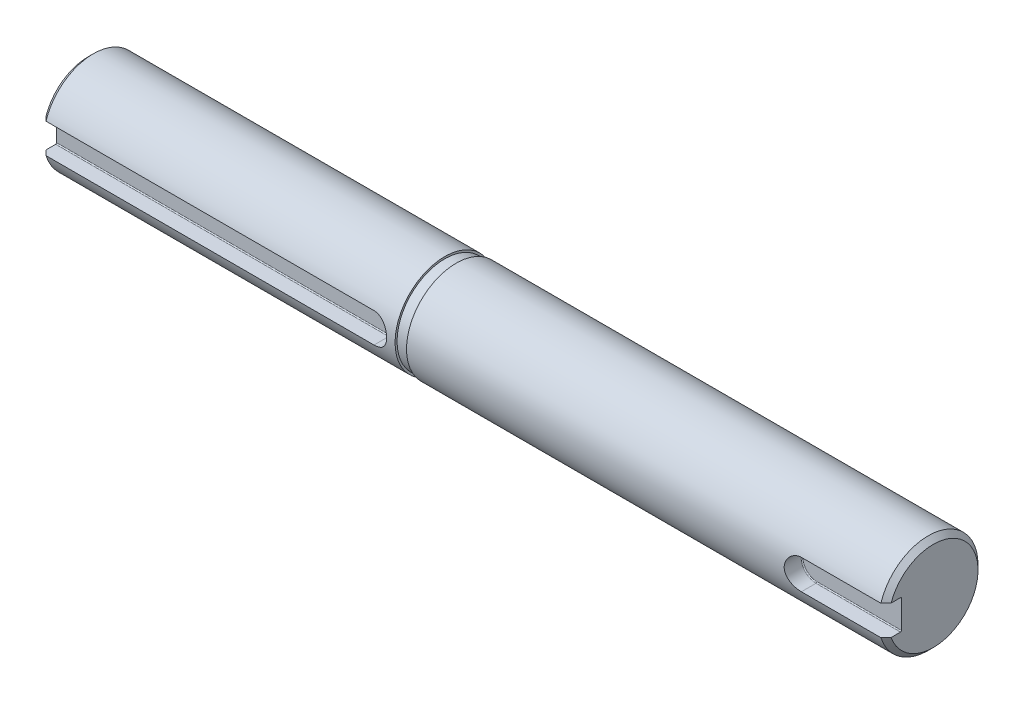
ISO-10303-21;
HEADER;
FILE_DESCRIPTION(('STEP AP214'),'2;1');
FILE_NAME('part.step','',(''),(''),'','','');
FILE_SCHEMA(('AUTOMOTIVE_DESIGN { 1 0 10303 214 1 1 1 1 }'));
ENDSEC;
DATA;
#1=APPLICATION_CONTEXT('core data for automotive mechanical design processes');
#2=APPLICATION_PROTOCOL_DEFINITION('international standard','automotive_design',2000,#1);
#3=PRODUCT_CONTEXT('',#1,'mechanical');
#4=PRODUCT('Part','Part','',(#3));
#5=PRODUCT_RELATED_PRODUCT_CATEGORY('part','',(#4));
#6=PRODUCT_DEFINITION_FORMATION('','',#4);
#7=PRODUCT_DEFINITION_CONTEXT('part definition',#1,'design');
#8=PRODUCT_DEFINITION('design','',#6,#7);
#9=PRODUCT_DEFINITION_SHAPE('','',#8);
#10=(LENGTH_UNIT() NAMED_UNIT(*) SI_UNIT(.MILLI.,.METRE.));
#11=(NAMED_UNIT(*) PLANE_ANGLE_UNIT() SI_UNIT($,.RADIAN.));
#12=(NAMED_UNIT(*) SI_UNIT($,.STERADIAN.) SOLID_ANGLE_UNIT());
#13=UNCERTAINTY_MEASURE_WITH_UNIT(LENGTH_MEASURE(1.E-05),#10,'distance_accuracy_value','');
#14=(GEOMETRIC_REPRESENTATION_CONTEXT(3) GLOBAL_UNCERTAINTY_ASSIGNED_CONTEXT((#13)) GLOBAL_UNIT_ASSIGNED_CONTEXT((#10,
#11,#12)) REPRESENTATION_CONTEXT('',''));
#15=CARTESIAN_POINT('',(0.,0.,0.));
#16=DIRECTION('',(0.,0.,1.));
#17=DIRECTION('',(1.,0.,0.));
#18=AXIS2_PLACEMENT_3D('',#15,#16,#17);
#19=CARTESIAN_POINT('',(0.,0.,0.));
#20=DIRECTION('',(-1.,0.,0.));
#21=DIRECTION('',(0.,0.,1.));
#22=AXIS2_PLACEMENT_3D('',#19,#20,#21);
#23=CYLINDRICAL_SURFACE('',#22,5.);
#24=CARTESIAN_POINT('',(35.,0.,5.));
#25=CARTESIAN_POINT('',(34.9999990025151,-0.0822886127533,4.9999992925055));
#26=CARTESIAN_POINT('',(34.993206136376,-0.16458731835153,4.99794915693954));
#27=CARTESIAN_POINT('',(34.9662786457779,-0.32678812530488,4.98997105593691));
#28=CARTESIAN_POINT('',(34.9461400419767,-0.406689504411418,4.98404193389692));
#29=CARTESIAN_POINT('',(34.8932539830897,-0.561732707754526,4.96895552501836));
#30=CARTESIAN_POINT('',(34.8605251303811,-0.636881364395373,4.95980300250425));
#31=CARTESIAN_POINT('',(34.7834639069442,-0.780624181053131,4.93922109237645));
#32=CARTESIAN_POINT('',(34.7391299926046,-0.849217467469667,4.92779140192067));
#33=CARTESIAN_POINT('',(34.6387759925273,-0.979871797183742,4.90350737192774));
#34=CARTESIAN_POINT('',(34.5824833741141,-1.04171807124434,4.89062383657036));
#35=CARTESIAN_POINT('',(34.4603907700898,-1.15524920923324,4.86505834210442));
#36=CARTESIAN_POINT('',(34.394589187875,-1.20693236327441,4.85237641724501));
#37=CARTESIAN_POINT('',(34.2535292469624,-1.29980037723707,4.82834113993772));
#38=CARTESIAN_POINT('',(34.1780915390093,-1.34072309022213,4.81702406663875));
#39=CARTESIAN_POINT('',(34.0210107457697,-1.4092139477476,4.79743620394031));
#40=CARTESIAN_POINT('',(33.939369156072,-1.43678529919973,4.78916468313311));
#41=CARTESIAN_POINT('',(33.7746097338695,-1.47701633682651,4.77690870838435));
#42=CARTESIAN_POINT('',(33.6915972561361,-1.49007196234677,4.77281069324534));
#43=CARTESIAN_POINT('',(33.5244668437832,-1.50213730614671,4.76902789749767));
#44=CARTESIAN_POINT('',(33.4403491819409,-1.50115042761078,4.76934204760571));
#45=CARTESIAN_POINT('',(33.2766160913915,-1.48546977199811,4.77424744067778));
#46=CARTESIAN_POINT('',(33.1969477496378,-1.47127205262685,4.77868388599141));
#47=CARTESIAN_POINT('',(33.0411802137265,-1.43037420427055,4.79108356228624));
#48=CARTESIAN_POINT('',(32.9650813726257,-1.4036728414164,4.79904714132351));
#49=CARTESIAN_POINT('',(32.8173996503393,-1.33816026653681,4.81772733074973));
#50=CARTESIAN_POINT('',(32.7458929160447,-1.29918816934642,4.82848016115952));
#51=CARTESIAN_POINT('',(32.6102679779898,-1.21035222588682,4.85150987000065));
#52=CARTESIAN_POINT('',(32.5461515705862,-1.16048574002588,4.86378711746991));
#53=CARTESIAN_POINT('',(32.424313809238,-1.04881290765546,4.88911011297937));
#54=CARTESIAN_POINT('',(32.3669713359703,-0.986594907466966,4.90216654310498));
#55=CARTESIAN_POINT('',(32.2634460159358,-0.85326325931396,4.92712244063259));
#56=CARTESIAN_POINT('',(32.2172638715856,-0.782149051860881,4.9390218351841));
#57=CARTESIAN_POINT('',(32.1371400775353,-0.632355038342795,4.9604316006947));
#58=CARTESIAN_POINT('',(32.1032824837501,-0.553627749747942,4.96992543668314));
#59=CARTESIAN_POINT('',(32.0494004099004,-0.391245415603511,4.98533521832222));
#60=CARTESIAN_POINT('',(32.0293720714675,-0.307591751589574,4.99125216186999));
#61=CARTESIAN_POINT('',(32.0043478221006,-0.140952242668326,4.99868364643538));
#62=CARTESIAN_POINT('',(31.9988384141984,-0.0580500976011819,5.0003485041779));
#63=CARTESIAN_POINT('',(32.0015691557121,0.107499605823387,4.9995292324176));
#64=CARTESIAN_POINT('',(32.0098074696515,0.190147196690784,4.99704565677756));
#65=CARTESIAN_POINT('',(32.0393846111115,0.350903605309698,4.98830696987163));
#66=CARTESIAN_POINT('',(32.0604233875809,0.42907277261417,4.98213829799417));
#67=CARTESIAN_POINT('',(32.1146432327782,0.580754638954522,4.96674347841533));
#68=CARTESIAN_POINT('',(32.1478257610379,0.654266777025584,4.95751696321085));
#69=CARTESIAN_POINT('',(32.2262531654811,0.796437189461054,4.93669654351325));
#70=CARTESIAN_POINT('',(32.271759340948,0.864943826199672,4.92505280829675));
#71=CARTESIAN_POINT('',(32.3732247540528,0.993523307980149,4.90073468764317));
#72=CARTESIAN_POINT('',(32.4291866118877,1.05359403235594,4.8880600443108));
#73=CARTESIAN_POINT('',(32.5523873083694,1.16585744551027,4.86253171869138));
#74=CARTESIAN_POINT('',(32.6199618757718,1.21768481231504,4.84968825033268));
#75=CARTESIAN_POINT('',(32.7631279390136,1.30928995072153,4.82576515238464));
#76=CARTESIAN_POINT('',(32.8387192245582,1.34906803829472,4.81468547654651));
#77=CARTESIAN_POINT('',(32.9955324912547,1.41517347127168,4.79567189615055));
#78=CARTESIAN_POINT('',(33.0767261865366,1.44156346937049,4.78772337843827));
#79=CARTESIAN_POINT('',(33.2426879689315,1.48021730815114,4.77591594362794));
#80=CARTESIAN_POINT('',(33.3274548207877,1.49248598978779,4.772055625083));
#81=CARTESIAN_POINT('',(33.4943615183762,1.50221984485059,4.76899972496087));
#82=CARTESIAN_POINT('',(33.5764636510176,1.5002805530849,4.76961647442755));
#83=CARTESIAN_POINT('',(33.7391141033728,1.48307505444813,4.77499401288294));
#84=CARTESIAN_POINT('',(33.8196624851764,1.46780938124716,4.77975463592551));
#85=CARTESIAN_POINT('',(33.9759453991429,1.42476888804136,4.79275763670386));
#86=CARTESIAN_POINT('',(34.0517272873617,1.39715175507068,4.80095604545965));
#87=CARTESIAN_POINT('',(34.1976424388177,1.33031507121129,4.81990278909136));
#88=CARTESIAN_POINT('',(34.2677746176408,1.29109329962876,4.83065161194312));
#89=CARTESIAN_POINT('',(34.4031631165271,1.20048763805072,4.85397676425833));
#90=CARTESIAN_POINT('',(34.4681487612604,1.14871276092994,4.86660540163798));
#91=CARTESIAN_POINT('',(34.5887024983079,1.03517434629782,4.89201320450026));
#92=CARTESIAN_POINT('',(34.6442681394678,0.973408217134498,4.90479240823905));
#93=CARTESIAN_POINT('',(34.746023412295,0.839465762183244,4.92950936570649));
#94=CARTESIAN_POINT('',(34.7918914468555,0.767037885790604,4.94141159765674));
#95=CARTESIAN_POINT('',(34.870735169904,0.615141373983525,4.96260680455813));
#96=CARTESIAN_POINT('',(34.9037168882745,0.535676052998949,4.97190099931067));
#97=CARTESIAN_POINT('',(34.9528952756528,0.380757712655275,4.98602174969301));
#98=CARTESIAN_POINT('',(34.9705116728833,0.305786961954229,4.99122027381068));
#99=CARTESIAN_POINT('',(34.9940635252416,0.153880195230777,4.99820944494492));
#100=CARTESIAN_POINT('',(35.0000009327048,0.0769445098581386,5.0000006615474));
#101=CARTESIAN_POINT('',(35.,0.,5.));
#102=B_SPLINE_CURVE_WITH_KNOTS('',3,(#24,#25,#26,#27,#28,#29,#30,#31,#32,#33,#34,#35,#36,#37,
#38,#39,#40,#41,#42,#43,#44,#45,#46,#47,#48,#49,#50,#51,#52,#53,#54,#55,#56,#57,#58,#59,#60,#61,
#62,#63,#64,#65,#66,#67,#68,#69,#70,#71,#72,#73,#74,#75,#76,#77,#78,#79,#80,#81,#82,#83,#84,#85,
#86,#87,#88,#89,#90,#91,#92,#93,#94,#95,#96,#97,#98,#99,#100,#101),.UNSPECIFIED.,.T.,.F.,(4,2,2,
2,2,2,2,2,2,2,2,2,2,2,2,2,2,2,2,2,2,2,2,2,2,2,2,2,2,2,2,2,2,2,2,2,2,2,4),(0.,0.24658320361261,
0.493239964845999,0.739533676300875,0.985860164412699,1.23855602948191,1.49129437288633,
1.74971481004109,2.00807314543224,2.25919689356598,2.51025978319088,2.75226016697675,
2.99428443658001,3.23962426447119,3.48502360158554,3.74067104048166,3.99633456531071,
4.25371046881688,4.51101453528807,4.75908809438544,5.00712853550325,5.24956746682325,
5.49203554593727,5.74011305702907,5.98825282000189,6.24540400322817,6.50254844252679,
6.7584781495125,7.01432009460281,7.2595015546694,7.50467319661598,7.74680040402719,
7.98897397553105,8.23996925679928,8.491029748975,8.74942996156668,9.00770911595233,
9.23831691930457,9.46888616948871),.UNSPECIFIED.);
#103=CARTESIAN_POINT('',(33.5,1.5,4.76969600708473));
#104=VERTEX_POINT('',#103);
#105=CARTESIAN_POINT('',(33.5,-1.49999999999999,4.76969600708473));
#106=VERTEX_POINT('',#105);
#107=EDGE_CURVE('E276',#104,#106,#102,.T.);
#108=ORIENTED_EDGE('',*,*,#107,.T.);
#109=DIRECTION('',(-1.,0.,0.));
#110=VECTOR('',#109,1.);
#111=CARTESIAN_POINT('',(0.,-1.5,4.76969600708473));
#112=LINE('',#111,#110);
#113=CARTESIAN_POINT('',(0.500000000000014,-1.5,4.76969600708473));
#114=VERTEX_POINT('',#113);
#115=EDGE_CURVE('E231',#106,#114,#112,.T.);
#116=ORIENTED_EDGE('',*,*,#115,.T.);
#117=CARTESIAN_POINT('',(0.500000000000014,0.,0.));
#118=DIRECTION('',(1.,0.,0.));
#119=DIRECTION('',(0.,0.,-1.));
#120=AXIS2_PLACEMENT_3D('',#117,#118,#119);
#121=CIRCLE('',#120,5.);
#122=CARTESIAN_POINT('',(0.500000000000014,1.5,4.76969600708473));
#123=VERTEX_POINT('',#122);
#124=EDGE_CURVE('E240',#114,#123,#121,.T.);
#125=ORIENTED_EDGE('',*,*,#124,.T.);
#126=DIRECTION('',(-1.,0.,0.));
#127=VECTOR('',#126,1.);
#128=CARTESIAN_POINT('',(0.,1.5,4.76969600708473));
#129=LINE('',#128,#127);
#130=EDGE_CURVE('E66',#123,#104,#129,.F.);
#131=ORIENTED_EDGE('',*,*,#130,.T.);
#132=EDGE_LOOP('',(#108,#116,#125,#131));
#133=FACE_BOUND('',#132,.T.);
#134=CARTESIAN_POINT('',(35.85,0.,0.));
#135=DIRECTION('',(-1.,0.,0.));
#136=DIRECTION('',(0.,0.,1.));
#137=AXIS2_PLACEMENT_3D('',#134,#135,#136);
#138=CIRCLE('',#137,5.);
#139=CARTESIAN_POINT('',(35.85,0.,5.));
#140=VERTEX_POINT('',#139);
#141=EDGE_CURVE('E177',#140,#140,#138,.T.);
#142=ORIENTED_EDGE('',*,*,#141,.T.);
#143=EDGE_LOOP('',(#142));
#144=FACE_BOUND('',#143,.T.);
#145=ADVANCED_FACE('F37',(#133,#144),#23,.T.);
#146=CARTESIAN_POINT('',(0.,5.,0.));
#147=DIRECTION('',(1.,0.,0.));
#148=DIRECTION('',(0.,0.,-1.));
#149=AXIS2_PLACEMENT_3D('',#146,#147,#148);
#150=PLANE('',#149);
#151=CARTESIAN_POINT('',(0.,1.4,3.3));
#152=DIRECTION('',(-1.,0.,0.));
#153=DIRECTION('',(0.,-1.,0.));
#154=AXIS2_PLACEMENT_3D('',#151,#152,#153);
#155=CIRCLE('',#154,0.1);
#156=CARTESIAN_POINT('',(0.,1.5,3.3));
#157=VERTEX_POINT('',#156);
#158=CARTESIAN_POINT('',(0.,1.4,3.2));
#159=VERTEX_POINT('',#158);
#160=EDGE_CURVE('E227',#157,#159,#155,.T.);
#161=ORIENTED_EDGE('',*,*,#160,.F.);
#162=DIRECTION('',(0.,0.,1.));
#163=VECTOR('',#162,1.);
#164=CARTESIAN_POINT('',(0.,1.5,3.2));
#165=LINE('',#164,#163);
#166=CARTESIAN_POINT('',(0.,1.5,4.24264068711928));
#167=VERTEX_POINT('',#166);
#168=EDGE_CURVE('E196',#157,#167,#165,.T.);
#169=ORIENTED_EDGE('',*,*,#168,.T.);
#170=CARTESIAN_POINT('',(0.,0.,0.));
#171=DIRECTION('',(1.,0.,0.));
#172=DIRECTION('',(0.,0.,-1.));
#173=AXIS2_PLACEMENT_3D('',#170,#171,#172);
#174=CIRCLE('',#173,4.49999999999999);
#175=CARTESIAN_POINT('',(0.,-1.5,4.24264068711927));
#176=VERTEX_POINT('',#175);
#177=EDGE_CURVE('E234',#167,#176,#174,.F.);
#178=ORIENTED_EDGE('',*,*,#177,.T.);
#179=DIRECTION('',(0.,0.,1.));
#180=VECTOR('',#179,1.);
#181=CARTESIAN_POINT('',(0.,-1.5,3.2));
#182=LINE('',#181,#180);
#183=CARTESIAN_POINT('',(0.,-1.5,3.3));
#184=VERTEX_POINT('',#183);
#185=EDGE_CURVE('E193',#184,#176,#182,.T.);
#186=ORIENTED_EDGE('',*,*,#185,.F.);
#187=CARTESIAN_POINT('',(0.,-1.4,3.3));
#188=DIRECTION('',(-1.,0.,0.));
#189=DIRECTION('',(0.,-1.,0.));
#190=AXIS2_PLACEMENT_3D('',#187,#188,#189);
#191=CIRCLE('',#190,0.1);
#192=CARTESIAN_POINT('',(0.,-1.4,3.2));
#193=VERTEX_POINT('',#192);
#194=EDGE_CURVE('E219',#184,#193,#191,.F.);
#195=ORIENTED_EDGE('',*,*,#194,.T.);
#196=DIRECTION('',(0.,-1.,0.));
#197=VECTOR('',#196,1.);
#198=CARTESIAN_POINT('',(0.,0.,3.2));
#199=LINE('',#198,#197);
#200=EDGE_CURVE('E204',#159,#193,#199,.T.);
#201=ORIENTED_EDGE('',*,*,#200,.F.);
#202=EDGE_LOOP('',(#161,#169,#178,#186,#195,#201));
#203=FACE_BOUND('',#202,.T.);
#204=ADVANCED_FACE('F289',(#203),#150,.F.);
#205=CARTESIAN_POINT('',(0.,0.,0.));
#206=DIRECTION('',(1.,0.,0.));
#207=DIRECTION('',(0.,0.,-1.));
#208=AXIS2_PLACEMENT_3D('',#205,#206,#207);
#209=CONICAL_SURFACE('',#208,4.49999999999999,0.785398163397445);
#210=CARTESIAN_POINT('',(-2.09064328129565,-1.5,1.88547070991989));
#211=CARTESIAN_POINT('',(-2.01792213967261,-1.5,1.97831125879684));
#212=CARTESIAN_POINT('',(-1.94400679445827,-1.5,2.07019661899431));
#213=CARTESIAN_POINT('',(-1.79432989797204,-1.5,2.25242998527388));
#214=CARTESIAN_POINT('',(-1.71856863716364,-1.5,2.34277822947699));
#215=CARTESIAN_POINT('',(-1.56574550539013,-1.5,2.52230808443302));
#216=CARTESIAN_POINT('',(-1.48868409392482,-1.5,2.61149008836677));
#217=CARTESIAN_POINT('',(-1.33353885371557,-1.5,2.78896631004594));
#218=CARTESIAN_POINT('',(-1.25545497910625,-1.5,2.87726048764924));
#219=CARTESIAN_POINT('',(-1.02011908128655,-1.5,3.14100497574602));
#220=CARTESIAN_POINT('',(-0.861700309074565,-1.5,3.31541303599291));
#221=CARTESIAN_POINT('',(-0.542887235584087,-1.5,3.66242977966639));
#222=CARTESIAN_POINT('',(-0.382492786094867,-1.5,3.83503832628206));
#223=CARTESIAN_POINT('',(-0.15509967943831,-1.5,4.0778385724207));
#224=CARTESIAN_POINT('',(-0.0886584214187635,-1.5,4.14855325256212));
#225=CARTESIAN_POINT('',(0.0444262766093582,-1.5,4.28979835668243));
#226=CARTESIAN_POINT('',(0.111069725914268,-1.5,4.36032877190298));
#227=CARTESIAN_POINT('',(0.373124943367441,-1.5,4.63699711310972));
#228=CARTESIAN_POINT('',(0.56918171461985,-1.5,4.84252415192619));
#229=CARTESIAN_POINT('',(0.962293748240147,-1.5,5.25262198002303));
#230=CARTESIAN_POINT('',(1.15934901732719,-1.5,5.45719276285066));
#231=CARTESIAN_POINT('',(1.55412683072634,-1.5,5.86559472239561));
#232=CARTESIAN_POINT('',(1.75184920475092,-1.5,6.06942606381643));
#233=CARTESIAN_POINT('',(2.14783110480796,-1.5,6.47655943334498));
#234=CARTESIAN_POINT('',(2.34609062125707,-1.5,6.67986147077096));
#235=CARTESIAN_POINT('',(2.54453379410457,-1.5,6.88298310155422));
#236=B_SPLINE_CURVE_WITH_KNOTS('',3,(#210,#211,#212,#213,#214,#215,#216,#217,#218,#219,#220,
#221,#222,#223,#224,#225,#226,#227,#228,#229,#230,#231,#232,#233,#234,#235),.UNSPECIFIED.,.F.,
.F.,(4,2,2,2,2,2,2,2,2,2,2,2,4),(0.,0.353760942374928,0.707466573792512,1.06104971356887,
1.41464876899149,2.12146772421683,2.828340030259,3.11943260912061,3.41053878102107,
4.26265766947193,5.11478229968583,5.96670377266869,6.81861014502528),.UNSPECIFIED.);
#237=EDGE_CURVE('E252',#176,#114,#236,.T.);
#238=ORIENTED_EDGE('',*,*,#237,.F.);
#239=ORIENTED_EDGE('',*,*,#177,.F.);
#240=CARTESIAN_POINT('',(2.54453379410457,1.5,6.88298310155422));
#241=CARTESIAN_POINT('',(2.34601980929174,1.5,6.679789504342));
#242=CARTESIAN_POINT('',(2.14769007664004,1.5,6.47641507149928));
#243=CARTESIAN_POINT('',(1.75158093835414,1.5,6.06914959144311));
#244=CARTESIAN_POINT('',(1.55380150747333,1.5,5.86525856877782));
#245=CARTESIAN_POINT('',(1.15903627299563,1.5,5.45686883198162));
#246=CARTESIAN_POINT('',(0.962050180166856,1.5,5.25237039771849));
#247=CARTESIAN_POINT('',(0.569067971913495,1.5,4.8424029795565));
#248=CARTESIAN_POINT('',(0.373071909858415,1.5,4.63693394446693));
#249=CARTESIAN_POINT('',(-0.0175923249112387,1.5,4.22449925316427));
#250=CARTESIAN_POINT('',(-0.212259629943728,1.5,4.01753277263556));
#251=CARTESIAN_POINT('',(-0.502562773828009,1.5,3.70552768407942));
#252=CARTESIAN_POINT('',(-0.599041330535615,1.5,3.60127355737198));
#253=CARTESIAN_POINT('',(-0.791277646732061,1.5,3.39209796630615));
#254=CARTESIAN_POINT('',(-0.887035390662185,1.5,3.28717648763266));
#255=CARTESIAN_POINT('',(-1.07766439761341,1.5,3.07642697830783));
#256=CARTESIAN_POINT('',(-1.17253515526144,1.5,2.97059848971515));
#257=CARTESIAN_POINT('',(-1.36101678987628,1.5,2.75783501804452));
#258=CARTESIAN_POINT('',(-1.45462774242785,1.5,2.65090010203617));
#259=CARTESIAN_POINT('',(-1.64016981739375,1.5,2.43549507246025));
#260=CARTESIAN_POINT('',(-1.73210020080091,1.5,2.32702431904526));
#261=CARTESIAN_POINT('',(-1.86815014271195,1.5,2.16276920050955));
#262=CARTESIAN_POINT('',(-1.91319702169461,1.5,2.10775363485128));
#263=CARTESIAN_POINT('',(-2.00252885267304,1.5,1.99710243867549));
#264=CARTESIAN_POINT('',(-2.04681375890611,1.5,1.94146677124416));
#265=CARTESIAN_POINT('',(-2.09064328129565,1.5,1.88547070991989));
#266=B_SPLINE_CURVE_WITH_KNOTS('',3,(#240,#241,#242,#243,#244,#245,#246,#247,#248,#249,#250,
#251,#252,#253,#254,#255,#256,#257,#258,#259,#260,#261,#262,#263,#264,#265),.UNSPECIFIED.,.F.,
.F.,(4,2,2,2,2,2,2,2,2,2,2,2,4),(0.,0.852209039502966,1.70437831468503,2.55620212008203,
3.40807136484073,4.26045194363135,4.68658707934536,5.11273138694527,5.53910527446831,
5.9654534656776,6.39198483439897,6.60529406984006,6.81861607184106),.UNSPECIFIED.);
#267=EDGE_CURVE('E246',#123,#167,#266,.T.);
#268=ORIENTED_EDGE('',*,*,#267,.F.);
#269=ORIENTED_EDGE('',*,*,#124,.F.);
#270=EDGE_LOOP('',(#238,#239,#268,#269));
#271=FACE_BOUND('',#270,.T.);
#272=ADVANCED_FACE('F258',(#271),#209,.T.);
#273=CARTESIAN_POINT('',(33.5,0.,5.));
#274=DIRECTION('',(0.,0.,1.));
#275=DIRECTION('',(1.,0.,0.));
#276=AXIS2_PLACEMENT_3D('',#273,#274,#275);
#277=CYLINDRICAL_SURFACE('',#276,1.5);
#278=ORIENTED_EDGE('',*,*,#107,.F.);
#279=DIRECTION('',(0.,0.,1.));
#280=VECTOR('',#279,1.);
#281=CARTESIAN_POINT('',(33.5,1.5,3.2));
#282=LINE('',#281,#280);
#283=CARTESIAN_POINT('',(33.5,1.5,3.3));
#284=VERTEX_POINT('',#283);
#285=EDGE_CURVE('E195',#104,#284,#282,.F.);
#286=ORIENTED_EDGE('',*,*,#285,.T.);
#287=CARTESIAN_POINT('',(33.5,0.,3.3));
#288=DIRECTION('',(0.,0.,1.));
#289=DIRECTION('',(1.,0.,0.));
#290=AXIS2_PLACEMENT_3D('',#287,#288,#289);
#291=CIRCLE('',#290,1.5);
#292=CARTESIAN_POINT('',(33.5,-1.49999999999999,3.3));
#293=VERTEX_POINT('',#292);
#294=EDGE_CURVE('E214',#293,#284,#291,.T.);
#295=ORIENTED_EDGE('',*,*,#294,.F.);
#296=DIRECTION('',(0.,0.,1.));
#297=VECTOR('',#296,1.);
#298=CARTESIAN_POINT('',(33.5,-1.49999999999999,3.2));
#299=LINE('',#298,#297);
#300=EDGE_CURVE('E201',#293,#106,#299,.T.);
#301=ORIENTED_EDGE('',*,*,#300,.T.);
#302=EDGE_LOOP('',(#278,#286,#295,#301));
#303=FACE_BOUND('',#302,.T.);
#304=ADVANCED_FACE('F269',(#303),#277,.F.);
#305=CARTESIAN_POINT('',(0.,-1.5,3.2));
#306=DIRECTION('',(0.,-1.,0.));
#307=DIRECTION('',(1.,0.,0.));
#308=AXIS2_PLACEMENT_3D('',#305,#306,#307);
#309=PLANE('',#308);
#310=ORIENTED_EDGE('',*,*,#300,.F.);
#311=DIRECTION('',(1.,0.,0.));
#312=VECTOR('',#311,1.);
#313=CARTESIAN_POINT('',(33.5,-1.49999999999999,3.3));
#314=LINE('',#313,#312);
#315=EDGE_CURVE('E212',#184,#293,#314,.T.);
#316=ORIENTED_EDGE('',*,*,#315,.F.);
#317=ORIENTED_EDGE('',*,*,#185,.T.);
#318=ORIENTED_EDGE('',*,*,#237,.T.);
#319=ORIENTED_EDGE('',*,*,#115,.F.);
#320=EDGE_LOOP('',(#310,#316,#317,#318,#319));
#321=FACE_BOUND('',#320,.T.);
#322=ADVANCED_FACE('F266',(#321),#309,.F.);
#323=CARTESIAN_POINT('',(0.,1.5,3.2));
#324=DIRECTION('',(0.,1.,0.));
#325=DIRECTION('',(-1.,0.,0.));
#326=AXIS2_PLACEMENT_3D('',#323,#324,#325);
#327=PLANE('',#326);
#328=ORIENTED_EDGE('',*,*,#267,.T.);
#329=ORIENTED_EDGE('',*,*,#168,.F.);
#330=DIRECTION('',(-1.,0.,0.));
#331=VECTOR('',#330,1.);
#332=CARTESIAN_POINT('',(0.,1.5,3.3));
#333=LINE('',#332,#331);
#334=EDGE_CURVE('E217',#284,#157,#333,.T.);
#335=ORIENTED_EDGE('',*,*,#334,.F.);
#336=ORIENTED_EDGE('',*,*,#285,.F.);
#337=ORIENTED_EDGE('',*,*,#130,.F.);
#338=EDGE_LOOP('',(#328,#329,#335,#336,#337));
#339=FACE_BOUND('',#338,.T.);
#340=ADVANCED_FACE('F261',(#339),#327,.F.);
#341=CARTESIAN_POINT('',(0.,0.,3.2));
#342=DIRECTION('',(0.,0.,1.));
#343=DIRECTION('',(1.,0.,0.));
#344=AXIS2_PLACEMENT_3D('',#341,#342,#343);
#345=PLANE('',#344);
#346=DIRECTION('',(1.,0.,0.));
#347=VECTOR('',#346,1.);
#348=CARTESIAN_POINT('',(0.,-1.4,3.2));
#349=LINE('',#348,#347);
#350=CARTESIAN_POINT('',(33.5,-1.39999999999999,3.2));
#351=VERTEX_POINT('',#350);
#352=EDGE_CURVE('E209',#351,#193,#349,.F.);
#353=ORIENTED_EDGE('',*,*,#352,.F.);
#354=CARTESIAN_POINT('',(33.5,0.,3.2));
#355=DIRECTION('',(0.,0.,1.));
#356=DIRECTION('',(1.,0.,0.));
#357=AXIS2_PLACEMENT_3D('',#354,#355,#356);
#358=CIRCLE('',#357,1.4);
#359=CARTESIAN_POINT('',(33.5,1.4,3.2));
#360=VERTEX_POINT('',#359);
#361=EDGE_CURVE('E207',#360,#351,#358,.F.);
#362=ORIENTED_EDGE('',*,*,#361,.F.);
#363=DIRECTION('',(-1.,0.,0.));
#364=VECTOR('',#363,1.);
#365=CARTESIAN_POINT('',(33.5,1.4,3.2));
#366=LINE('',#365,#364);
#367=EDGE_CURVE('E205',#159,#360,#366,.F.);
#368=ORIENTED_EDGE('',*,*,#367,.F.);
#369=ORIENTED_EDGE('',*,*,#200,.T.);
#370=EDGE_LOOP('',(#353,#362,#368,#369));
#371=FACE_BOUND('',#370,.T.);
#372=ADVANCED_FACE('F265',(#371),#345,.T.);
#373=CARTESIAN_POINT('',(33.5,0.,3.3));
#374=DIRECTION('',(0.,0.,1.));
#375=DIRECTION('',(1.,0.,0.));
#376=AXIS2_PLACEMENT_3D('',#373,#374,#375);
#377=TOROIDAL_SURFACE('',#376,1.4,0.1);
#378=CARTESIAN_POINT('',(33.5,-1.39999999999999,3.3));
#379=DIRECTION('',(-1.,0.,0.));
#380=DIRECTION('',(0.,0.,1.));
#381=AXIS2_PLACEMENT_3D('',#378,#379,#380);
#382=CIRCLE('',#381,0.1);
#383=EDGE_CURVE('E192',#351,#293,#382,.T.);
#384=ORIENTED_EDGE('',*,*,#383,.T.);
#385=ORIENTED_EDGE('',*,*,#294,.T.);
#386=CARTESIAN_POINT('',(33.5,1.4,3.3));
#387=DIRECTION('',(-1.,0.,0.));
#388=DIRECTION('',(0.,0.,1.));
#389=AXIS2_PLACEMENT_3D('',#386,#387,#388);
#390=CIRCLE('',#389,0.1);
#391=EDGE_CURVE('E199',#284,#360,#390,.T.);
#392=ORIENTED_EDGE('',*,*,#391,.T.);
#393=ORIENTED_EDGE('',*,*,#361,.T.);
#394=EDGE_LOOP('',(#384,#385,#392,#393));
#395=FACE_BOUND('',#394,.T.);
#396=ADVANCED_FACE('F322',(#395),#377,.F.);
#397=CARTESIAN_POINT('',(0.,1.4,3.3));
#398=DIRECTION('',(1.,0.,0.));
#399=DIRECTION('',(0.,1.,0.));
#400=AXIS2_PLACEMENT_3D('',#397,#398,#399);
#401=CYLINDRICAL_SURFACE('',#400,0.1);
#402=ORIENTED_EDGE('',*,*,#391,.F.);
#403=ORIENTED_EDGE('',*,*,#334,.T.);
#404=ORIENTED_EDGE('',*,*,#160,.T.);
#405=ORIENTED_EDGE('',*,*,#367,.T.);
#406=EDGE_LOOP('',(#402,#403,#404,#405));
#407=FACE_BOUND('',#406,.T.);
#408=ADVANCED_FACE('F309',(#407),#401,.F.);
#409=CARTESIAN_POINT('',(0.,-1.4,3.3));
#410=DIRECTION('',(-1.,0.,0.));
#411=DIRECTION('',(0.,-1.,0.));
#412=AXIS2_PLACEMENT_3D('',#409,#410,#411);
#413=CYLINDRICAL_SURFACE('',#412,0.1);
#414=ORIENTED_EDGE('',*,*,#383,.F.);
#415=ORIENTED_EDGE('',*,*,#352,.T.);
#416=ORIENTED_EDGE('',*,*,#194,.F.);
#417=ORIENTED_EDGE('',*,*,#315,.T.);
#418=EDGE_LOOP('',(#414,#415,#416,#417));
#419=FACE_BOUND('',#418,.T.);
#420=ADVANCED_FACE('F274',(#419),#413,.F.);
#421=CARTESIAN_POINT('',(35.85,4.8,0.));
#422=DIRECTION('',(1.,0.,0.));
#423=DIRECTION('',(0.,0.,-1.));
#424=AXIS2_PLACEMENT_3D('',#421,#422,#423);
#425=PLANE('',#424);
#426=CARTESIAN_POINT('',(35.85,0.,0.));
#427=DIRECTION('',(-1.,0.,0.));
#428=DIRECTION('',(0.,0.,1.));
#429=AXIS2_PLACEMENT_3D('',#426,#427,#428);
#430=CIRCLE('',#429,4.8);
#431=CARTESIAN_POINT('',(35.85,0.,4.8));
#432=VERTEX_POINT('',#431);
#433=EDGE_CURVE('E563',#432,#432,#430,.T.);
#434=ORIENTED_EDGE('',*,*,#433,.T.);
#435=EDGE_LOOP('',(#434));
#436=FACE_BOUND('',#435,.T.);
#437=ORIENTED_EDGE('',*,*,#141,.F.);
#438=EDGE_LOOP('',(#437));
#439=FACE_BOUND('',#438,.T.);
#440=ADVANCED_FACE('F336',(#436,#439),#425,.T.);
#441=CARTESIAN_POINT('',(37.,4.8,0.));
#442=DIRECTION('',(-1.,0.,0.));
#443=DIRECTION('',(0.,0.,1.));
#444=AXIS2_PLACEMENT_3D('',#441,#442,#443);
#445=PLANE('',#444);
#446=CARTESIAN_POINT('',(37.,0.,0.));
#447=DIRECTION('',(-1.,0.,0.));
#448=DIRECTION('',(0.,0.,1.));
#449=AXIS2_PLACEMENT_3D('',#446,#447,#448);
#450=CIRCLE('',#449,5.);
#451=CARTESIAN_POINT('',(37.,0.,5.));
#452=VERTEX_POINT('',#451);
#453=EDGE_CURVE('E565',#452,#452,#450,.T.);
#454=ORIENTED_EDGE('',*,*,#453,.T.);
#455=EDGE_LOOP('',(#454));
#456=FACE_BOUND('',#455,.T.);
#457=CARTESIAN_POINT('',(37.,0.,0.));
#458=DIRECTION('',(-1.,0.,0.));
#459=DIRECTION('',(0.,0.,1.));
#460=AXIS2_PLACEMENT_3D('',#457,#458,#459);
#461=CIRCLE('',#460,4.8);
#462=CARTESIAN_POINT('',(37.,0.,4.8));
#463=VERTEX_POINT('',#462);
#464=EDGE_CURVE('E561',#463,#463,#461,.T.);
#465=ORIENTED_EDGE('',*,*,#464,.F.);
#466=EDGE_LOOP('',(#465));
#467=FACE_BOUND('',#466,.T.);
#468=ADVANCED_FACE('F340',(#456,#467),#445,.T.);
#469=CARTESIAN_POINT('',(0.,0.,0.));
#470=DIRECTION('',(-1.,0.,0.));
#471=DIRECTION('',(0.,0.,1.));
#472=AXIS2_PLACEMENT_3D('',#469,#470,#471);
#473=CYLINDRICAL_SURFACE('',#472,4.8);
#474=ORIENTED_EDGE('',*,*,#464,.T.);
#475=EDGE_LOOP('',(#474));
#476=FACE_BOUND('',#475,.T.);
#477=ORIENTED_EDGE('',*,*,#433,.F.);
#478=EDGE_LOOP('',(#477));
#479=FACE_BOUND('',#478,.T.);
#480=ADVANCED_FACE('F346',(#476,#479),#473,.T.);
#481=CARTESIAN_POINT('',(0.,0.,3.2));
#482=DIRECTION('',(0.,0.,1.));
#483=DIRECTION('',(1.,0.,0.));
#484=AXIS2_PLACEMENT_3D('',#481,#482,#483);
#485=PLANE('',#484);
#486=DIRECTION('',(-1.,0.,0.));
#487=VECTOR('',#486,1.);
#488=CARTESIAN_POINT('',(85.,1.4,3.2));
#489=LINE('',#488,#487);
#490=CARTESIAN_POINT('',(76.5,1.4,3.2));
#491=VERTEX_POINT('',#490);
#492=CARTESIAN_POINT('',(85.,1.4,3.2));
#493=VERTEX_POINT('',#492);
#494=EDGE_CURVE('E162',#491,#493,#489,.F.);
#495=ORIENTED_EDGE('',*,*,#494,.F.);
#496=CARTESIAN_POINT('',(76.5,0.,3.2));
#497=DIRECTION('',(0.,0.,1.));
#498=DIRECTION('',(1.,0.,0.));
#499=AXIS2_PLACEMENT_3D('',#496,#497,#498);
#500=CIRCLE('',#499,1.4);
#501=CARTESIAN_POINT('',(76.5,-1.4,3.2));
#502=VERTEX_POINT('',#501);
#503=EDGE_CURVE('E156',#502,#491,#500,.F.);
#504=ORIENTED_EDGE('',*,*,#503,.F.);
#505=DIRECTION('',(1.,0.,0.));
#506=VECTOR('',#505,1.);
#507=CARTESIAN_POINT('',(76.5,-1.4,3.2));
#508=LINE('',#507,#506);
#509=CARTESIAN_POINT('',(85.,-1.4,3.2));
#510=VERTEX_POINT('',#509);
#511=EDGE_CURVE('E146',#510,#502,#508,.F.);
#512=ORIENTED_EDGE('',*,*,#511,.F.);
#513=DIRECTION('',(0.,1.,0.));
#514=VECTOR('',#513,1.);
#515=CARTESIAN_POINT('',(85.,0.,3.2));
#516=LINE('',#515,#514);
#517=EDGE_CURVE('E157',#510,#493,#516,.T.);
#518=ORIENTED_EDGE('',*,*,#517,.T.);
#519=EDGE_LOOP('',(#495,#504,#512,#518));
#520=FACE_BOUND('',#519,.T.);
#521=ADVANCED_FACE('F160',(#520),#485,.T.);
#522=CARTESIAN_POINT('',(75.,1.4,3.3));
#523=DIRECTION('',(1.,0.,0.));
#524=DIRECTION('',(0.,1.,0.));
#525=AXIS2_PLACEMENT_3D('',#522,#523,#524);
#526=CYLINDRICAL_SURFACE('',#525,0.1);
#527=CARTESIAN_POINT('',(76.5,1.4,3.3));
#528=DIRECTION('',(1.,0.,0.));
#529=DIRECTION('',(0.,0.,-1.));
#530=AXIS2_PLACEMENT_3D('',#527,#528,#529);
#531=CIRCLE('',#530,0.1);
#532=CARTESIAN_POINT('',(76.5,1.5,3.3));
#533=VERTEX_POINT('',#532);
#534=EDGE_CURVE('E172',#491,#533,#531,.T.);
#535=ORIENTED_EDGE('',*,*,#534,.F.);
#536=ORIENTED_EDGE('',*,*,#494,.T.);
#537=CARTESIAN_POINT('',(85.,1.4,3.3));
#538=DIRECTION('',(1.,0.,0.));
#539=DIRECTION('',(0.,0.,-1.));
#540=AXIS2_PLACEMENT_3D('',#537,#538,#539);
#541=CIRCLE('',#540,0.1);
#542=CARTESIAN_POINT('',(85.,1.5,3.3));
#543=VERTEX_POINT('',#542);
#544=EDGE_CURVE('E183',#543,#493,#541,.F.);
#545=ORIENTED_EDGE('',*,*,#544,.F.);
#546=DIRECTION('',(-1.,0.,0.));
#547=VECTOR('',#546,1.);
#548=CARTESIAN_POINT('',(76.5,1.5,3.3));
#549=LINE('',#548,#547);
#550=EDGE_CURVE('E381',#543,#533,#549,.T.);
#551=ORIENTED_EDGE('',*,*,#550,.T.);
#552=EDGE_LOOP('',(#535,#536,#545,#551));
#553=FACE_BOUND('',#552,.T.);
#554=ADVANCED_FACE('F384',(#553),#526,.F.);
#555=CARTESIAN_POINT('',(76.5,0.,3.3));
#556=DIRECTION('',(0.,0.,1.));
#557=DIRECTION('',(1.,0.,0.));
#558=AXIS2_PLACEMENT_3D('',#555,#556,#557);
#559=TOROIDAL_SURFACE('',#558,1.4,0.1);
#560=ORIENTED_EDGE('',*,*,#534,.T.);
#561=CARTESIAN_POINT('',(76.5,0.,3.3));
#562=DIRECTION('',(0.,0.,1.));
#563=DIRECTION('',(1.,0.,0.));
#564=AXIS2_PLACEMENT_3D('',#561,#562,#563);
#565=CIRCLE('',#564,1.5);
#566=CARTESIAN_POINT('',(76.5,-1.5,3.3));
#567=VERTEX_POINT('',#566);
#568=EDGE_CURVE('E170',#533,#567,#565,.T.);
#569=ORIENTED_EDGE('',*,*,#568,.T.);
#570=CARTESIAN_POINT('',(76.5,-1.4,3.3));
#571=DIRECTION('',(1.,0.,0.));
#572=DIRECTION('',(0.,0.,-1.));
#573=AXIS2_PLACEMENT_3D('',#570,#571,#572);
#574=CIRCLE('',#573,0.1);
#575=EDGE_CURVE('E150',#567,#502,#574,.T.);
#576=ORIENTED_EDGE('',*,*,#575,.T.);
#577=ORIENTED_EDGE('',*,*,#503,.T.);
#578=EDGE_LOOP('',(#560,#569,#576,#577));
#579=FACE_BOUND('',#578,.T.);
#580=ADVANCED_FACE('F168',(#579),#559,.F.);
#581=CARTESIAN_POINT('',(75.,-1.4,3.3));
#582=DIRECTION('',(-1.,0.,0.));
#583=DIRECTION('',(0.,-1.,0.));
#584=AXIS2_PLACEMENT_3D('',#581,#582,#583);
#585=CYLINDRICAL_SURFACE('',#584,0.1);
#586=ORIENTED_EDGE('',*,*,#575,.F.);
#587=DIRECTION('',(1.,0.,0.));
#588=VECTOR('',#587,1.);
#589=CARTESIAN_POINT('',(85.,-1.5,3.3));
#590=LINE('',#589,#588);
#591=CARTESIAN_POINT('',(85.,-1.5,3.3));
#592=VERTEX_POINT('',#591);
#593=EDGE_CURVE('E186',#567,#592,#590,.T.);
#594=ORIENTED_EDGE('',*,*,#593,.T.);
#595=CARTESIAN_POINT('',(85.,-1.4,3.3));
#596=DIRECTION('',(1.,0.,0.));
#597=DIRECTION('',(0.,0.,-1.));
#598=AXIS2_PLACEMENT_3D('',#595,#596,#597);
#599=CIRCLE('',#598,0.1);
#600=EDGE_CURVE('E153',#592,#510,#599,.T.);
#601=ORIENTED_EDGE('',*,*,#600,.T.);
#602=ORIENTED_EDGE('',*,*,#511,.T.);
#603=EDGE_LOOP('',(#586,#594,#601,#602));
#604=FACE_BOUND('',#603,.T.);
#605=ADVANCED_FACE('F148',(#604),#585,.F.);
#606=CARTESIAN_POINT('',(85.,0.,0.));
#607=DIRECTION('',(-1.,0.,0.));
#608=DIRECTION('',(0.,0.,1.));
#609=AXIS2_PLACEMENT_3D('',#606,#607,#608);
#610=PLANE('',#609);
#611=ORIENTED_EDGE('',*,*,#600,.F.);
#612=DIRECTION('',(0.,0.,1.));
#613=VECTOR('',#612,1.);
#614=CARTESIAN_POINT('',(85.,-1.5,3.2));
#615=LINE('',#614,#613);
#616=CARTESIAN_POINT('',(85.,-1.5,4.24264068711927));
#617=VERTEX_POINT('',#616);
#618=EDGE_CURVE('E171',#592,#617,#615,.T.);
#619=ORIENTED_EDGE('',*,*,#618,.T.);
#620=CARTESIAN_POINT('',(85.,0.,0.));
#621=DIRECTION('',(-1.,0.,0.));
#622=DIRECTION('',(0.,0.,1.));
#623=AXIS2_PLACEMENT_3D('',#620,#621,#622);
#624=CIRCLE('',#623,4.5);
#625=CARTESIAN_POINT('',(85.,1.5,4.24264068711927));
#626=VERTEX_POINT('',#625);
#627=EDGE_CURVE('E243',#617,#626,#624,.F.);
#628=ORIENTED_EDGE('',*,*,#627,.T.);
#629=DIRECTION('',(0.,0.,1.));
#630=VECTOR('',#629,1.);
#631=CARTESIAN_POINT('',(85.,1.5,3.2));
#632=LINE('',#631,#630);
#633=EDGE_CURVE('E175',#543,#626,#632,.T.);
#634=ORIENTED_EDGE('',*,*,#633,.F.);
#635=ORIENTED_EDGE('',*,*,#544,.T.);
#636=ORIENTED_EDGE('',*,*,#517,.F.);
#637=EDGE_LOOP('',(#611,#619,#628,#634,#635,#636));
#638=FACE_BOUND('',#637,.T.);
#639=ADVANCED_FACE('F293',(#638),#610,.F.);
#640=CARTESIAN_POINT('',(84.5,0.,0.));
#641=DIRECTION('',(-1.,0.,0.));
#642=DIRECTION('',(0.,0.,1.));
#643=AXIS2_PLACEMENT_3D('',#640,#641,#642);
#644=CONICAL_SURFACE('',#643,5.,0.785398163397465);
#645=CARTESIAN_POINT('',(87.0906432812956,1.5,1.88547070991986));
#646=CARTESIAN_POINT('',(87.0179221396726,1.5,1.97831125879682));
#647=CARTESIAN_POINT('',(86.9440067944582,1.5,2.07019661899429));
#648=CARTESIAN_POINT('',(86.794329897972,1.5,2.25242998527386));
#649=CARTESIAN_POINT('',(86.7185686371636,1.5,2.34277822947696));
#650=CARTESIAN_POINT('',(86.5657455053901,1.5,2.52230808443299));
#651=CARTESIAN_POINT('',(86.4886840939248,1.5,2.61149008836674));
#652=CARTESIAN_POINT('',(86.3335388537156,1.5,2.78896631004592));
#653=CARTESIAN_POINT('',(86.2554549791062,1.5,2.87726048764921));
#654=CARTESIAN_POINT('',(86.0201190812866,1.5,3.14100497574599));
#655=CARTESIAN_POINT('',(85.8617003090746,1.5,3.31541303599288));
#656=CARTESIAN_POINT('',(85.5428872355841,1.5,3.66242977966636));
#657=CARTESIAN_POINT('',(85.3824927860949,1.5,3.83503832628202));
#658=CARTESIAN_POINT('',(85.1550996794384,1.5,4.07783857242067));
#659=CARTESIAN_POINT('',(85.0886584214188,1.5,4.1485532525621));
#660=CARTESIAN_POINT('',(84.9555737233907,1.5,4.28979835668241));
#661=CARTESIAN_POINT('',(84.8889302740858,1.5,4.36032877190297));
#662=CARTESIAN_POINT('',(84.6268750566326,1.5,4.63699711310971));
#663=CARTESIAN_POINT('',(84.4308182853802,1.5,4.84252415192618));
#664=CARTESIAN_POINT('',(84.0377062517599,1.5,5.25262198002302));
#665=CARTESIAN_POINT('',(83.8406509826729,1.5,5.45719276285064));
#666=CARTESIAN_POINT('',(83.4458731692738,1.5,5.8655947223956));
#667=CARTESIAN_POINT('',(83.2481507952492,1.5,6.06942606381642));
#668=CARTESIAN_POINT('',(82.8521688951922,1.5,6.47655943334498));
#669=CARTESIAN_POINT('',(82.653909378743,1.5,6.67986147077096));
#670=CARTESIAN_POINT('',(82.4554662058955,1.5,6.88298310155423));
#671=B_SPLINE_CURVE_WITH_KNOTS('',3,(#645,#646,#647,#648,#649,#650,#651,#652,#653,#654,#655,
#656,#657,#658,#659,#660,#661,#662,#663,#664,#665,#666,#667,#668,#669,#670),.UNSPECIFIED.,.F.,
.F.,(4,2,2,2,2,2,2,2,2,2,2,2,4),(0.,0.353760942374925,0.707466573792507,1.06104971356886,
1.41464876899146,2.12146772421679,2.82834003025894,3.11943260912056,3.41053878102103,
4.26265766947187,5.11478229968576,5.96670377266862,6.8186101450252),.UNSPECIFIED.);
#672=CARTESIAN_POINT('',(84.5,1.5,4.76969600708473));
#673=VERTEX_POINT('',#672);
#674=EDGE_CURVE('E51',#626,#673,#671,.T.);
#675=ORIENTED_EDGE('',*,*,#674,.F.);
#676=ORIENTED_EDGE('',*,*,#627,.F.);
#677=CARTESIAN_POINT('',(82.4554662058955,-1.5,6.88298310155423));
#678=CARTESIAN_POINT('',(82.6539801907084,-1.5,6.67978950434201));
#679=CARTESIAN_POINT('',(82.8523099233601,-1.5,6.47641507149928));
#680=CARTESIAN_POINT('',(83.2484190616459,-1.5,6.06914959144311));
#681=CARTESIAN_POINT('',(83.4461984925267,-1.5,5.86525856877782));
#682=CARTESIAN_POINT('',(83.8409637270044,-1.5,5.45686883198162));
#683=CARTESIAN_POINT('',(84.0379498198332,-1.5,5.25237039771849));
#684=CARTESIAN_POINT('',(84.4309320280865,-1.5,4.8424029795565));
#685=CARTESIAN_POINT('',(84.6269280901416,-1.5,4.63693394446693));
#686=CARTESIAN_POINT('',(85.0175923249113,-1.5,4.22449925316426));
#687=CARTESIAN_POINT('',(85.2122596299437,-1.5,4.01753277263554));
#688=CARTESIAN_POINT('',(85.502562773828,-1.5,3.7055276840794));
#689=CARTESIAN_POINT('',(85.5990413305356,-1.5,3.60127355737197));
#690=CARTESIAN_POINT('',(85.7912776467321,-1.5,3.39209796630613));
#691=CARTESIAN_POINT('',(85.8870353906622,-1.5,3.28717648763264));
#692=CARTESIAN_POINT('',(86.0776643976134,-1.5,3.07642697830781));
#693=CARTESIAN_POINT('',(86.1725351552614,-1.5,2.97059848971512));
#694=CARTESIAN_POINT('',(86.3610167898763,-1.5,2.75783501804449));
#695=CARTESIAN_POINT('',(86.4546277424278,-1.5,2.65090010203614));
#696=CARTESIAN_POINT('',(86.6401698173937,-1.5,2.43549507246022));
#697=CARTESIAN_POINT('',(86.7321002008009,-1.5,2.32702431904523));
#698=CARTESIAN_POINT('',(86.8681501427119,-1.5,2.16276920050952));
#699=CARTESIAN_POINT('',(86.9131970216946,-1.5,2.10775363485125));
#700=CARTESIAN_POINT('',(87.002528852673,-1.5,1.99710243867546));
#701=CARTESIAN_POINT('',(87.0468137589061,-1.5,1.94146677124413));
#702=CARTESIAN_POINT('',(87.0906432812956,-1.5,1.88547070991986));
#703=B_SPLINE_CURVE_WITH_KNOTS('',3,(#677,#678,#679,#680,#681,#682,#683,#684,#685,#686,#687,
#688,#689,#690,#691,#692,#693,#694,#695,#696,#697,#698,#699,#700,#701,#702),.UNSPECIFIED.,.F.,
.F.,(4,2,2,2,2,2,2,2,2,2,2,2,4),(0.,0.85220903950295,1.704378314685,2.55620212008198,
3.40807136484069,4.2604519436313,4.68658707934529,5.11273138694522,5.53910527446824,
5.96545346567753,6.3919848343989,6.60529406984,6.81861607184097),.UNSPECIFIED.);
#704=CARTESIAN_POINT('',(84.5,-1.5,4.76969600708473));
#705=VERTEX_POINT('',#704);
#706=EDGE_CURVE('E280',#705,#617,#703,.T.);
#707=ORIENTED_EDGE('',*,*,#706,.F.);
#708=CARTESIAN_POINT('',(84.5,0.,0.));
#709=DIRECTION('',(-1.,0.,0.));
#710=DIRECTION('',(0.,0.,1.));
#711=AXIS2_PLACEMENT_3D('',#708,#709,#710);
#712=CIRCLE('',#711,5.);
#713=EDGE_CURVE('E237',#673,#705,#712,.T.);
#714=ORIENTED_EDGE('',*,*,#713,.F.);
#715=EDGE_LOOP('',(#675,#676,#707,#714));
#716=FACE_BOUND('',#715,.T.);
#717=ADVANCED_FACE('F39',(#716),#644,.T.);
#718=CARTESIAN_POINT('',(75.,1.5,3.2));
#719=DIRECTION('',(0.,1.,0.));
#720=DIRECTION('',(-1.,0.,0.));
#721=AXIS2_PLACEMENT_3D('',#718,#719,#720);
#722=PLANE('',#721);
#723=DIRECTION('',(0.,0.,1.));
#724=VECTOR('',#723,1.);
#725=CARTESIAN_POINT('',(76.5,1.5,3.2));
#726=LINE('',#725,#724);
#727=CARTESIAN_POINT('',(76.5,1.5,4.76969600708473));
#728=VERTEX_POINT('',#727);
#729=EDGE_CURVE('E374',#533,#728,#726,.T.);
#730=ORIENTED_EDGE('',*,*,#729,.F.);
#731=ORIENTED_EDGE('',*,*,#550,.F.);
#732=ORIENTED_EDGE('',*,*,#633,.T.);
#733=ORIENTED_EDGE('',*,*,#674,.T.);
#734=DIRECTION('',(-1.,0.,0.));
#735=VECTOR('',#734,1.);
#736=CARTESIAN_POINT('',(0.,1.50000000000001,4.76969600708473));
#737=LINE('',#736,#735);
#738=EDGE_CURVE('E189',#728,#673,#737,.F.);
#739=ORIENTED_EDGE('',*,*,#738,.F.);
#740=EDGE_LOOP('',(#730,#731,#732,#733,#739));
#741=FACE_BOUND('',#740,.T.);
#742=ADVANCED_FACE('F353',(#741),#722,.F.);
#743=CARTESIAN_POINT('',(76.5,0.,3.2));
#744=DIRECTION('',(0.,0.,1.));
#745=DIRECTION('',(1.,0.,0.));
#746=AXIS2_PLACEMENT_3D('',#743,#744,#745);
#747=CYLINDRICAL_SURFACE('',#746,1.5);
#748=DIRECTION('',(0.,0.,1.));
#749=VECTOR('',#748,1.);
#750=CARTESIAN_POINT('',(76.5,-1.5,3.2));
#751=LINE('',#750,#749);
#752=CARTESIAN_POINT('',(76.5,-1.5,4.76969600708473));
#753=VERTEX_POINT('',#752);
#754=EDGE_CURVE('E182',#753,#567,#751,.F.);
#755=ORIENTED_EDGE('',*,*,#754,.T.);
#756=ORIENTED_EDGE('',*,*,#568,.F.);
#757=ORIENTED_EDGE('',*,*,#729,.T.);
#758=CARTESIAN_POINT('',(76.5,-1.5,4.76969600708473));
#759=CARTESIAN_POINT('',(76.458820607092,-1.50000085357071,4.76969249084934));
#760=CARTESIAN_POINT('',(76.4176619568739,-1.49830317083428,4.77022997000129));
#761=CARTESIAN_POINT('',(76.3356588379045,-1.49153785660317,4.77235095109999));
#762=CARTESIAN_POINT('',(76.2948143006051,-1.48647098275841,4.77393421787376));
#763=CARTESIAN_POINT('',(76.1734094590454,-1.46630203689311,4.78018490618873));
#764=CARTESIAN_POINT('',(76.0936936095837,-1.44623120413663,4.78635370384275));
#765=CARTESIAN_POINT('',(75.9389644216141,-1.39353102315626,4.80195952113208));
#766=CARTESIAN_POINT('',(75.8639494478019,-1.36090607068203,4.81139539670393));
#767=CARTESIAN_POINT('',(75.7204033184024,-1.28407841117655,4.83246571212052));
#768=CARTESIAN_POINT('',(75.6518752002716,-1.23987031651226,4.84410117434933));
#769=CARTESIAN_POINT('',(75.521133944003,-1.13964850658326,4.86866835244721));
#770=CARTESIAN_POINT('',(75.4591563396566,-1.08333433465209,4.88162755412974));
#771=CARTESIAN_POINT('',(75.3453644161,-0.961138919873356,4.90714811559049));
#772=CARTESIAN_POINT('',(75.293551813997,-0.895256063916352,4.91970940785249));
#773=CARTESIAN_POINT('',(75.2005362296815,-0.754109921315433,4.94333239727705));
#774=CARTESIAN_POINT('',(75.1595748197021,-0.678680819336261,4.95435770971354));
#775=CARTESIAN_POINT('',(75.0910115883819,-0.521621185505775,4.97334469846208));
#776=CARTESIAN_POINT('',(75.0634063222057,-0.43999225901293,4.98130716463903));
#777=CARTESIAN_POINT('',(75.023120200898,-0.275324697874882,4.99307639935002));
#778=CARTESIAN_POINT('',(75.0100351420303,-0.192393125294257,4.99699549276993));
#779=CARTESIAN_POINT('',(74.9978826586368,-0.0254235719980864,5.00063202022426));
#780=CARTESIAN_POINT('',(74.9988125802999,0.0586141962423568,5.00035024971471));
#781=CARTESIAN_POINT('',(75.014392908759,0.222571599946011,4.99569602566267));
#782=CARTESIAN_POINT('',(75.0286053449787,0.302537145464636,4.99145415509187));
#783=CARTESIAN_POINT('',(75.0696316352381,0.458890052102021,4.9795151369998));
#784=CARTESIAN_POINT('',(75.0964461494559,0.535277225531992,4.97181780846028));
#785=CARTESIAN_POINT('',(75.1622122216464,0.683347815892208,4.95365214926145));
#786=CARTESIAN_POINT('',(75.2013016443569,0.754966006044131,4.94315255692526));
#787=CARTESIAN_POINT('',(75.2903985900483,0.89076552957441,4.92049624651755));
#788=CARTESIAN_POINT('',(75.3404085594788,0.954945191614586,4.90833915735884));
#789=CARTESIAN_POINT('',(75.4521919880835,1.07665450541274,4.88311673571409));
#790=CARTESIAN_POINT('',(75.5143438637608,1.13383351478034,4.87003445449554));
#791=CARTESIAN_POINT('',(75.6474974234279,1.23706769492487,4.84484215114658));
#792=CARTESIAN_POINT('',(75.7185016803655,1.28311962013078,4.83273241337565));
#793=CARTESIAN_POINT('',(75.8682809284493,1.36316407240863,4.81077228795653));
#794=CARTESIAN_POINT('',(75.9471271795934,1.39703006341135,4.80094596245948));
#795=CARTESIAN_POINT('',(76.1097245039818,1.45085886004699,4.78495663653201));
#796=CARTESIAN_POINT('',(76.1934678607144,1.47084293218035,4.77878803475875));
#797=CARTESIAN_POINT('',(76.3149948890702,1.4890120359008,4.77314032325006));
#798=CARTESIAN_POINT('',(76.3518907341796,1.49313202989009,4.77185156275267));
#799=CARTESIAN_POINT('',(76.4258514790995,1.49862355614854,4.77012928611782));
#800=CARTESIAN_POINT('',(76.4629160496639,1.49999912968269,4.76969451246644));
#801=CARTESIAN_POINT('',(76.5,1.5,4.76969600708473));
#802=B_SPLINE_CURVE_WITH_KNOTS('',3,(#758,#759,#760,#761,#762,#763,#764,#765,#766,#767,#768,
#769,#770,#771,#772,#773,#774,#775,#776,#777,#778,#779,#780,#781,#782,#783,#784,#785,#786,#787,
#788,#789,#790,#791,#792,#793,#794,#795,#796,#797,#798,#799,#800,#801),.UNSPECIFIED.,.F.,.F.,(4,
2,2,2,2,2,2,2,2,2,2,2,2,2,2,2,2,2,2,2,2,4),(0.,0.123459071219737,0.246890388853026,
0.492911349615204,0.73884624588433,0.984895736828089,1.23795510798803,1.49105719006936,
1.74939356197455,2.00766326783256,2.25854751319801,2.5093842528947,2.75223130012966,
2.99509107067835,3.24078242562729,3.48652887757004,3.74172568310981,3.99699683536778,
4.25484698071527,4.51230123440206,4.62365084745811,4.73483637253615),.UNSPECIFIED.);
#803=EDGE_CURVE('E11',#753,#728,#802,.T.);
#804=ORIENTED_EDGE('',*,*,#803,.F.);
#805=EDGE_LOOP('',(#755,#756,#757,#804));
#806=FACE_BOUND('',#805,.T.);
#807=ADVANCED_FACE('F356',(#806),#747,.F.);
#808=CARTESIAN_POINT('',(75.,-1.5,3.2));
#809=DIRECTION('',(0.,-1.,0.));
#810=DIRECTION('',(1.,0.,0.));
#811=AXIS2_PLACEMENT_3D('',#808,#809,#810);
#812=PLANE('',#811);
#813=ORIENTED_EDGE('',*,*,#706,.T.);
#814=ORIENTED_EDGE('',*,*,#618,.F.);
#815=ORIENTED_EDGE('',*,*,#593,.F.);
#816=ORIENTED_EDGE('',*,*,#754,.F.);
#817=DIRECTION('',(-1.,0.,0.));
#818=VECTOR('',#817,1.);
#819=CARTESIAN_POINT('',(0.,-1.50000000000001,4.76969600708473));
#820=LINE('',#819,#818);
#821=EDGE_CURVE('E58',#705,#753,#820,.T.);
#822=ORIENTED_EDGE('',*,*,#821,.F.);
#823=EDGE_LOOP('',(#813,#814,#815,#816,#822));
#824=FACE_BOUND('',#823,.T.);
#825=ADVANCED_FACE('F358',(#824),#812,.F.);
#826=ORIENTED_EDGE('',*,*,#821,.T.);
#827=ORIENTED_EDGE('',*,*,#803,.T.);
#828=ORIENTED_EDGE('',*,*,#738,.T.);
#829=ORIENTED_EDGE('',*,*,#713,.T.);
#830=EDGE_LOOP('',(#826,#827,#828,#829));
#831=FACE_BOUND('',#830,.T.);
#832=ORIENTED_EDGE('',*,*,#453,.F.);
#833=EDGE_LOOP('',(#832));
#834=FACE_BOUND('',#833,.T.);
#835=ADVANCED_FACE('F291',(#831,#834),#23,.T.);
#836=CLOSED_SHELL('',(#145,#204,#272,#304,#322,#340,#372,#396,#408,#420,#440,#468,#480,#521,
#554,#580,#605,#639,#717,#742,#807,#825,#835));
#837=MANIFOLD_SOLID_BREP('B2',#836);
#838=ADVANCED_BREP_SHAPE_REPRESENTATION('',(#18,#837),#14);
#839=SHAPE_DEFINITION_REPRESENTATION(#9,#838);
ENDSEC;
END-ISO-10303-21;
